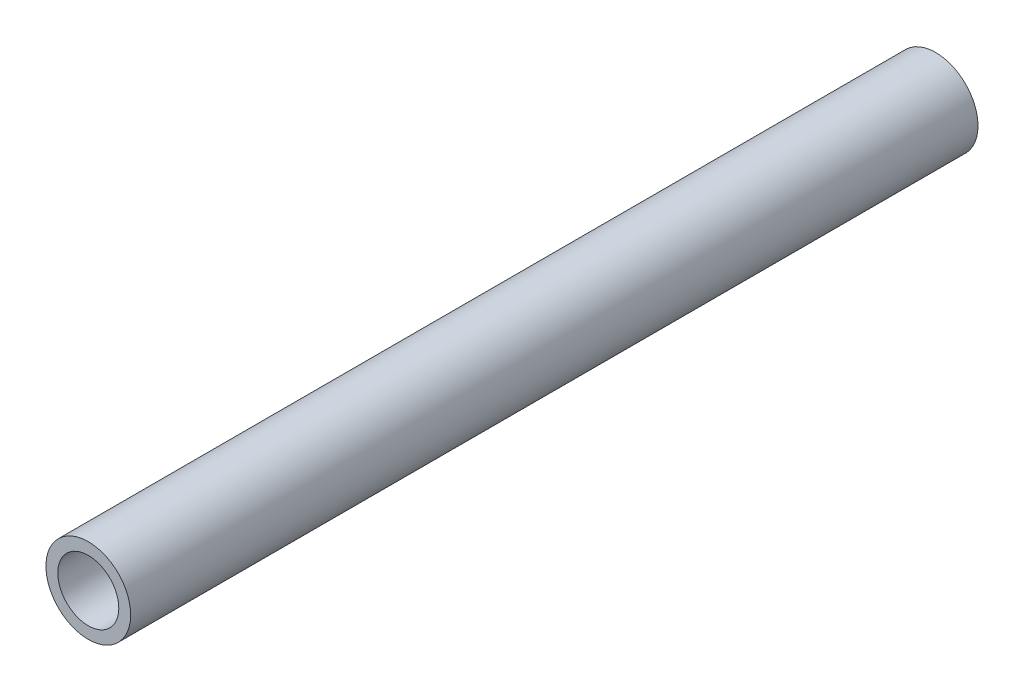
ISO-10303-21;
HEADER;
FILE_DESCRIPTION(('STEP AP214'),'2;1');
FILE_NAME('part.step','',(''),(''),'','','');
FILE_SCHEMA(('AUTOMOTIVE_DESIGN { 1 0 10303 214 1 1 1 1 }'));
ENDSEC;
DATA;
#1=APPLICATION_CONTEXT('core data for automotive mechanical design processes');
#2=APPLICATION_PROTOCOL_DEFINITION('international standard','automotive_design',2000,#1);
#3=PRODUCT_CONTEXT('',#1,'mechanical');
#4=PRODUCT('Part','Part','',(#3));
#5=PRODUCT_RELATED_PRODUCT_CATEGORY('part','',(#4));
#6=PRODUCT_DEFINITION_FORMATION('','',#4);
#7=PRODUCT_DEFINITION_CONTEXT('part definition',#1,'design');
#8=PRODUCT_DEFINITION('design','',#6,#7);
#9=PRODUCT_DEFINITION_SHAPE('','',#8);
#10=(LENGTH_UNIT() NAMED_UNIT(*) SI_UNIT(.MILLI.,.METRE.));
#11=(NAMED_UNIT(*) PLANE_ANGLE_UNIT() SI_UNIT($,.RADIAN.));
#12=(NAMED_UNIT(*) SI_UNIT($,.STERADIAN.) SOLID_ANGLE_UNIT());
#13=UNCERTAINTY_MEASURE_WITH_UNIT(LENGTH_MEASURE(1.E-05),#10,'distance_accuracy_value','');
#14=(GEOMETRIC_REPRESENTATION_CONTEXT(3) GLOBAL_UNCERTAINTY_ASSIGNED_CONTEXT((#13)) GLOBAL_UNIT_ASSIGNED_CONTEXT((#10,
#11,#12)) REPRESENTATION_CONTEXT('',''));
#15=CARTESIAN_POINT('',(0.,0.,0.));
#16=DIRECTION('',(0.,0.,1.));
#17=DIRECTION('',(1.,0.,0.));
#18=AXIS2_PLACEMENT_3D('',#15,#16,#17);
#19=CARTESIAN_POINT('',(0.,0.,63.5));
#20=DIRECTION('',(0.,0.,1.));
#21=DIRECTION('',(1.,0.,0.));
#22=AXIS2_PLACEMENT_3D('',#19,#20,#21);
#23=PLANE('',#22);
#24=CARTESIAN_POINT('',(0.,0.,63.5));
#25=DIRECTION('',(0.,0.,1.));
#26=DIRECTION('',(1.,0.,0.));
#27=AXIS2_PLACEMENT_3D('',#24,#25,#26);
#28=CIRCLE('',#27,3.175);
#29=CARTESIAN_POINT('',(3.175,0.,63.5));
#30=VERTEX_POINT('',#29);
#31=EDGE_CURVE('E10',#30,#30,#28,.T.);
#32=ORIENTED_EDGE('',*,*,#31,.T.);
#33=EDGE_LOOP('',(#32));
#34=FACE_BOUND('',#33,.T.);
#35=CARTESIAN_POINT('',(0.,0.,63.5));
#36=DIRECTION('',(0.,0.,1.));
#37=DIRECTION('',(1.,0.,0.));
#38=AXIS2_PLACEMENT_3D('',#35,#36,#37);
#39=CIRCLE('',#38,2.286);
#40=CARTESIAN_POINT('',(2.286,0.,63.5));
#41=VERTEX_POINT('',#40);
#42=EDGE_CURVE('E48',#41,#41,#39,.T.);
#43=ORIENTED_EDGE('',*,*,#42,.F.);
#44=EDGE_LOOP('',(#43));
#45=FACE_BOUND('',#44,.T.);
#46=ADVANCED_FACE('F37',(#34,#45),#23,.T.);
#47=CARTESIAN_POINT('',(0.,0.,0.));
#48=DIRECTION('',(0.,0.,1.));
#49=DIRECTION('',(1.,0.,0.));
#50=AXIS2_PLACEMENT_3D('',#47,#48,#49);
#51=PLANE('',#50);
#52=CARTESIAN_POINT('',(0.,0.,0.));
#53=DIRECTION('',(0.,0.,1.));
#54=DIRECTION('',(1.,0.,0.));
#55=AXIS2_PLACEMENT_3D('',#52,#53,#54);
#56=CIRCLE('',#55,3.175);
#57=CARTESIAN_POINT('',(3.175,0.,0.));
#58=VERTEX_POINT('',#57);
#59=EDGE_CURVE('E41',#58,#58,#56,.T.);
#60=ORIENTED_EDGE('',*,*,#59,.F.);
#61=EDGE_LOOP('',(#60));
#62=FACE_BOUND('',#61,.T.);
#63=CARTESIAN_POINT('',(0.,0.,0.));
#64=DIRECTION('',(0.,0.,1.));
#65=DIRECTION('',(1.,0.,0.));
#66=AXIS2_PLACEMENT_3D('',#63,#64,#65);
#67=CIRCLE('',#66,2.286);
#68=CARTESIAN_POINT('',(2.286,0.,0.));
#69=VERTEX_POINT('',#68);
#70=EDGE_CURVE('E50',#69,#69,#67,.T.);
#71=ORIENTED_EDGE('',*,*,#70,.T.);
#72=EDGE_LOOP('',(#71));
#73=FACE_BOUND('',#72,.T.);
#74=ADVANCED_FACE('F60',(#62,#73),#51,.F.);
#75=CARTESIAN_POINT('',(0.,0.,63.5));
#76=DIRECTION('',(0.,0.,-1.));
#77=DIRECTION('',(-1.,0.,0.));
#78=AXIS2_PLACEMENT_3D('',#75,#76,#77);
#79=CYLINDRICAL_SURFACE('',#78,3.175);
#80=ORIENTED_EDGE('',*,*,#31,.F.);
#81=EDGE_LOOP('',(#80));
#82=FACE_BOUND('',#81,.T.);
#83=ORIENTED_EDGE('',*,*,#59,.T.);
#84=EDGE_LOOP('',(#83));
#85=FACE_BOUND('',#84,.T.);
#86=ADVANCED_FACE('F39',(#82,#85),#79,.T.);
#87=CARTESIAN_POINT('',(0.,0.,63.5));
#88=DIRECTION('',(0.,0.,-1.));
#89=DIRECTION('',(-1.,0.,0.));
#90=AXIS2_PLACEMENT_3D('',#87,#88,#89);
#91=CYLINDRICAL_SURFACE('',#90,2.286);
#92=ORIENTED_EDGE('',*,*,#42,.T.);
#93=EDGE_LOOP('',(#92));
#94=FACE_BOUND('',#93,.T.);
#95=ORIENTED_EDGE('',*,*,#70,.F.);
#96=EDGE_LOOP('',(#95));
#97=FACE_BOUND('',#96,.T.);
#98=ADVANCED_FACE('F56',(#94,#97),#91,.F.);
#99=CLOSED_SHELL('',(#46,#74,#86,#98));
#100=MANIFOLD_SOLID_BREP('B2',#99);
#101=ADVANCED_BREP_SHAPE_REPRESENTATION('',(#18,#100),#14);
#102=SHAPE_DEFINITION_REPRESENTATION(#9,#101);
ENDSEC;
END-ISO-10303-21;
